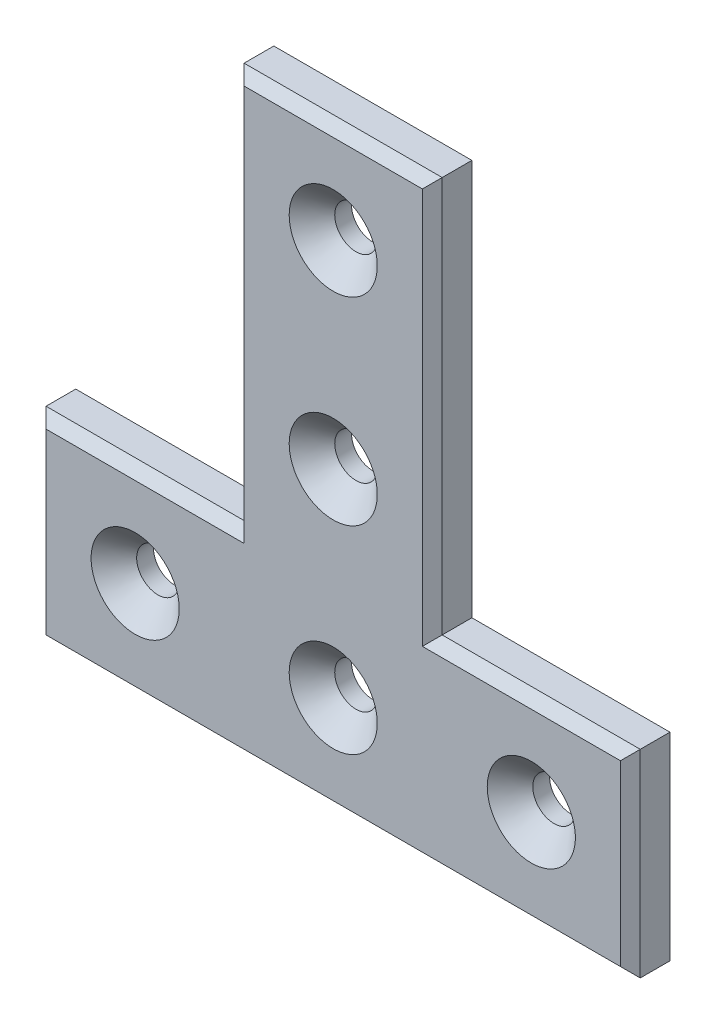
ISO-10303-21;
HEADER;
FILE_DESCRIPTION(('STEP AP214'),'2;1');
FILE_NAME('part.step','',(''),(''),'','','');
FILE_SCHEMA(('AUTOMOTIVE_DESIGN { 1 0 10303 214 1 1 1 1 }'));
ENDSEC;
DATA;
#1=APPLICATION_CONTEXT('core data for automotive mechanical design processes');
#2=APPLICATION_PROTOCOL_DEFINITION('international standard','automotive_design',2000,#1);
#3=PRODUCT_CONTEXT('',#1,'mechanical');
#4=PRODUCT('Part','Part','',(#3));
#5=PRODUCT_RELATED_PRODUCT_CATEGORY('part','',(#4));
#6=PRODUCT_DEFINITION_FORMATION('','',#4);
#7=PRODUCT_DEFINITION_CONTEXT('part definition',#1,'design');
#8=PRODUCT_DEFINITION('design','',#6,#7);
#9=PRODUCT_DEFINITION_SHAPE('','',#8);
#10=(LENGTH_UNIT() NAMED_UNIT(*) SI_UNIT(.MILLI.,.METRE.));
#11=(NAMED_UNIT(*) PLANE_ANGLE_UNIT() SI_UNIT($,.RADIAN.));
#12=(NAMED_UNIT(*) SI_UNIT($,.STERADIAN.) SOLID_ANGLE_UNIT());
#13=UNCERTAINTY_MEASURE_WITH_UNIT(LENGTH_MEASURE(1.E-05),#10,'distance_accuracy_value','');
#14=(GEOMETRIC_REPRESENTATION_CONTEXT(3) GLOBAL_UNCERTAINTY_ASSIGNED_CONTEXT((#13)) GLOBAL_UNIT_ASSIGNED_CONTEXT((#10,
#11,#12)) REPRESENTATION_CONTEXT('',''));
#15=CARTESIAN_POINT('',(0.,0.,0.));
#16=DIRECTION('',(0.,0.,1.));
#17=DIRECTION('',(1.,0.,0.));
#18=AXIS2_PLACEMENT_3D('',#15,#16,#17);
#19=CARTESIAN_POINT('',(0.,0.,4.));
#20=DIRECTION('',(0.,0.,-1.));
#21=DIRECTION('',(-1.,0.,0.));
#22=AXIS2_PLACEMENT_3D('',#19,#20,#21);
#23=PLANE('',#22);
#24=DIRECTION('',(0.,-1.,0.));
#25=VECTOR('',#24,1.);
#26=CARTESIAN_POINT('',(-29.,0.,4.));
#27=LINE('',#26,#25);
#28=CARTESIAN_POINT('',(-29.,9.00000000000001,4.));
#29=VERTEX_POINT('',#28);
#30=CARTESIAN_POINT('',(-29.,-9.00000000000001,4.));
#31=VERTEX_POINT('',#30);
#32=EDGE_CURVE('E226',#29,#31,#27,.T.);
#33=ORIENTED_EDGE('',*,*,#32,.T.);
#34=DIRECTION('',(1.,0.,0.));
#35=VECTOR('',#34,1.);
#36=CARTESIAN_POINT('',(0.,-9.00000000000001,4.));
#37=LINE('',#36,#35);
#38=CARTESIAN_POINT('',(29.,-9.00000000000001,4.));
#39=VERTEX_POINT('',#38);
#40=EDGE_CURVE('E228',#31,#39,#37,.T.);
#41=ORIENTED_EDGE('',*,*,#40,.T.);
#42=DIRECTION('',(0.,1.,0.));
#43=VECTOR('',#42,1.);
#44=CARTESIAN_POINT('',(29.,0.,4.));
#45=LINE('',#44,#43);
#46=CARTESIAN_POINT('',(29.,9.00000000000001,4.));
#47=VERTEX_POINT('',#46);
#48=EDGE_CURVE('E214',#39,#47,#45,.T.);
#49=ORIENTED_EDGE('',*,*,#48,.T.);
#50=DIRECTION('',(-1.,0.,0.));
#51=VECTOR('',#50,1.);
#52=CARTESIAN_POINT('',(0.,9.00000000000001,4.));
#53=LINE('',#52,#51);
#54=CARTESIAN_POINT('',(9.00000000000001,9.00000000000001,4.));
#55=VERTEX_POINT('',#54);
#56=EDGE_CURVE('E216',#47,#55,#53,.T.);
#57=ORIENTED_EDGE('',*,*,#56,.T.);
#58=DIRECTION('',(0.,1.,0.));
#59=VECTOR('',#58,1.);
#60=CARTESIAN_POINT('',(9.00000000000001,0.,4.));
#61=LINE('',#60,#59);
#62=CARTESIAN_POINT('',(9.00000000000001,49.,4.));
#63=VERTEX_POINT('',#62);
#64=EDGE_CURVE('E218',#55,#63,#61,.T.);
#65=ORIENTED_EDGE('',*,*,#64,.T.);
#66=DIRECTION('',(-1.,0.,0.));
#67=VECTOR('',#66,1.);
#68=CARTESIAN_POINT('',(0.,49.,4.));
#69=LINE('',#68,#67);
#70=CARTESIAN_POINT('',(-9.00000000000001,49.,4.));
#71=VERTEX_POINT('',#70);
#72=EDGE_CURVE('E220',#63,#71,#69,.T.);
#73=ORIENTED_EDGE('',*,*,#72,.T.);
#74=DIRECTION('',(0.,-1.,0.));
#75=VECTOR('',#74,1.);
#76=CARTESIAN_POINT('',(-9.00000000000001,0.,4.));
#77=LINE('',#76,#75);
#78=CARTESIAN_POINT('',(-9.00000000000001,9.00000000000001,4.));
#79=VERTEX_POINT('',#78);
#80=EDGE_CURVE('E222',#71,#79,#77,.T.);
#81=ORIENTED_EDGE('',*,*,#80,.T.);
#82=DIRECTION('',(-1.,0.,0.));
#83=VECTOR('',#82,1.);
#84=CARTESIAN_POINT('',(0.,9.00000000000001,4.));
#85=LINE('',#84,#83);
#86=EDGE_CURVE('E224',#79,#29,#85,.T.);
#87=ORIENTED_EDGE('',*,*,#86,.T.);
#88=EDGE_LOOP('',(#33,#41,#49,#57,#65,#73,#81,#87));
#89=FACE_BOUND('',#88,.T.);
#90=CARTESIAN_POINT('',(20.,0.,4.));
#91=DIRECTION('',(0.,0.,-1.));
#92=DIRECTION('',(-1.,0.,0.));
#93=AXIS2_PLACEMENT_3D('',#90,#91,#92);
#94=CIRCLE('',#93,4.45000000000002);
#95=CARTESIAN_POINT('',(15.55,0.,4.));
#96=VERTEX_POINT('',#95);
#97=EDGE_CURVE('E199',#96,#96,#94,.T.);
#98=ORIENTED_EDGE('',*,*,#97,.T.);
#99=EDGE_LOOP('',(#98));
#100=FACE_BOUND('',#99,.T.);
#101=CARTESIAN_POINT('',(0.,0.,4.));
#102=DIRECTION('',(0.,0.,-1.));
#103=DIRECTION('',(-1.,0.,0.));
#104=AXIS2_PLACEMENT_3D('',#101,#102,#103);
#105=CIRCLE('',#104,4.45000000000003);
#106=CARTESIAN_POINT('',(-4.45000000000003,0.,4.));
#107=VERTEX_POINT('',#106);
#108=EDGE_CURVE('E196',#107,#107,#105,.T.);
#109=ORIENTED_EDGE('',*,*,#108,.T.);
#110=EDGE_LOOP('',(#109));
#111=FACE_BOUND('',#110,.T.);
#112=CARTESIAN_POINT('',(-20.,0.,4.));
#113=DIRECTION('',(0.,0.,-1.));
#114=DIRECTION('',(-1.,0.,0.));
#115=AXIS2_PLACEMENT_3D('',#112,#113,#114);
#116=CIRCLE('',#115,4.45000000000002);
#117=CARTESIAN_POINT('',(-15.55,0.,4.));
#118=VERTEX_POINT('',#117);
#119=EDGE_CURVE('E193',#118,#118,#116,.T.);
#120=ORIENTED_EDGE('',*,*,#119,.T.);
#121=EDGE_LOOP('',(#120));
#122=FACE_BOUND('',#121,.T.);
#123=CARTESIAN_POINT('',(0.,20.,4.));
#124=DIRECTION('',(0.,0.,-1.));
#125=DIRECTION('',(-1.,0.,0.));
#126=AXIS2_PLACEMENT_3D('',#123,#124,#125);
#127=CIRCLE('',#126,4.45000000000002);
#128=CARTESIAN_POINT('',(-4.45000000000002,20.,4.));
#129=VERTEX_POINT('',#128);
#130=EDGE_CURVE('E190',#129,#129,#127,.T.);
#131=ORIENTED_EDGE('',*,*,#130,.T.);
#132=EDGE_LOOP('',(#131));
#133=FACE_BOUND('',#132,.T.);
#134=CARTESIAN_POINT('',(0.,40.,4.));
#135=DIRECTION('',(0.,0.,-1.));
#136=DIRECTION('',(-1.,0.,0.));
#137=AXIS2_PLACEMENT_3D('',#134,#135,#136);
#138=CIRCLE('',#137,4.45000000000002);
#139=CARTESIAN_POINT('',(-4.45000000000002,40.,4.));
#140=VERTEX_POINT('',#139);
#141=EDGE_CURVE('E187',#140,#140,#138,.T.);
#142=ORIENTED_EDGE('',*,*,#141,.T.);
#143=EDGE_LOOP('',(#142));
#144=FACE_BOUND('',#143,.T.);
#145=ADVANCED_FACE('F37',(#89,#100,#111,#122,#133,#144),#23,.F.);
#146=CARTESIAN_POINT('',(0.,0.,0.));
#147=DIRECTION('',(0.,0.,-1.));
#148=DIRECTION('',(-1.,0.,0.));
#149=AXIS2_PLACEMENT_3D('',#146,#147,#148);
#150=PLANE('',#149);
#151=CARTESIAN_POINT('',(0.,40.,0.));
#152=DIRECTION('',(0.,0.,1.));
#153=DIRECTION('',(1.,0.,0.));
#154=AXIS2_PLACEMENT_3D('',#151,#152,#153);
#155=CIRCLE('',#154,2.15);
#156=CARTESIAN_POINT('',(2.15,40.,0.));
#157=VERTEX_POINT('',#156);
#158=EDGE_CURVE('E271',#157,#157,#155,.T.);
#159=ORIENTED_EDGE('',*,*,#158,.T.);
#160=EDGE_LOOP('',(#159));
#161=FACE_BOUND('',#160,.T.);
#162=CARTESIAN_POINT('',(0.,20.,0.));
#163=DIRECTION('',(0.,0.,1.));
#164=DIRECTION('',(1.,0.,0.));
#165=AXIS2_PLACEMENT_3D('',#162,#163,#164);
#166=CIRCLE('',#165,2.15);
#167=CARTESIAN_POINT('',(2.15,20.,0.));
#168=VERTEX_POINT('',#167);
#169=EDGE_CURVE('E154',#168,#168,#166,.T.);
#170=ORIENTED_EDGE('',*,*,#169,.T.);
#171=EDGE_LOOP('',(#170));
#172=FACE_BOUND('',#171,.T.);
#173=DIRECTION('',(0.,1.,0.));
#174=VECTOR('',#173,1.);
#175=CARTESIAN_POINT('',(30.,-10.,0.));
#176=LINE('',#175,#174);
#177=CARTESIAN_POINT('',(30.,-10.,0.));
#178=VERTEX_POINT('',#177);
#179=CARTESIAN_POINT('',(30.,10.,0.));
#180=VERTEX_POINT('',#179);
#181=EDGE_CURVE('E142',#178,#180,#176,.T.);
#182=ORIENTED_EDGE('',*,*,#181,.F.);
#183=DIRECTION('',(1.,0.,0.));
#184=VECTOR('',#183,1.);
#185=CARTESIAN_POINT('',(-30.,-10.,0.));
#186=LINE('',#185,#184);
#187=CARTESIAN_POINT('',(-30.,-10.,0.));
#188=VERTEX_POINT('',#187);
#189=EDGE_CURVE('E171',#188,#178,#186,.T.);
#190=ORIENTED_EDGE('',*,*,#189,.F.);
#191=DIRECTION('',(0.,-1.,0.));
#192=VECTOR('',#191,1.);
#193=CARTESIAN_POINT('',(-30.,-10.,0.));
#194=LINE('',#193,#192);
#195=CARTESIAN_POINT('',(-30.,10.,0.));
#196=VERTEX_POINT('',#195);
#197=EDGE_CURVE('E168',#196,#188,#194,.T.);
#198=ORIENTED_EDGE('',*,*,#197,.F.);
#199=DIRECTION('',(-1.,0.,0.));
#200=VECTOR('',#199,1.);
#201=CARTESIAN_POINT('',(-30.,10.,0.));
#202=LINE('',#201,#200);
#203=CARTESIAN_POINT('',(-10.,10.,0.));
#204=VERTEX_POINT('',#203);
#205=EDGE_CURVE('E165',#204,#196,#202,.T.);
#206=ORIENTED_EDGE('',*,*,#205,.F.);
#207=DIRECTION('',(0.,-1.,0.));
#208=VECTOR('',#207,1.);
#209=CARTESIAN_POINT('',(-10.,10.,0.));
#210=LINE('',#209,#208);
#211=CARTESIAN_POINT('',(-10.,50.,0.));
#212=VERTEX_POINT('',#211);
#213=EDGE_CURVE('E162',#212,#204,#210,.T.);
#214=ORIENTED_EDGE('',*,*,#213,.F.);
#215=DIRECTION('',(-1.,0.,0.));
#216=VECTOR('',#215,1.);
#217=CARTESIAN_POINT('',(-10.,50.,0.));
#218=LINE('',#217,#216);
#219=CARTESIAN_POINT('',(10.,50.,0.));
#220=VERTEX_POINT('',#219);
#221=EDGE_CURVE('E159',#220,#212,#218,.T.);
#222=ORIENTED_EDGE('',*,*,#221,.F.);
#223=DIRECTION('',(0.,1.,0.));
#224=VECTOR('',#223,1.);
#225=CARTESIAN_POINT('',(10.,10.,0.));
#226=LINE('',#225,#224);
#227=CARTESIAN_POINT('',(10.,10.,0.));
#228=VERTEX_POINT('',#227);
#229=EDGE_CURVE('E145',#228,#220,#226,.T.);
#230=ORIENTED_EDGE('',*,*,#229,.F.);
#231=DIRECTION('',(-1.,0.,0.));
#232=VECTOR('',#231,1.);
#233=CARTESIAN_POINT('',(10.,10.,0.));
#234=LINE('',#233,#232);
#235=EDGE_CURVE('E129',#180,#228,#234,.T.);
#236=ORIENTED_EDGE('',*,*,#235,.F.);
#237=EDGE_LOOP('',(#182,#190,#198,#206,#214,#222,#230,#236));
#238=FACE_BOUND('',#237,.T.);
#239=CARTESIAN_POINT('',(20.,0.,0.));
#240=DIRECTION('',(0.,0.,1.));
#241=DIRECTION('',(1.,0.,0.));
#242=AXIS2_PLACEMENT_3D('',#239,#240,#241);
#243=CIRCLE('',#242,2.15);
#244=CARTESIAN_POINT('',(22.15,0.,0.));
#245=VERTEX_POINT('',#244);
#246=EDGE_CURVE('E151',#245,#245,#243,.T.);
#247=ORIENTED_EDGE('',*,*,#246,.T.);
#248=EDGE_LOOP('',(#247));
#249=FACE_BOUND('',#248,.T.);
#250=CARTESIAN_POINT('',(-20.,0.,0.));
#251=DIRECTION('',(0.,0.,1.));
#252=DIRECTION('',(1.,0.,0.));
#253=AXIS2_PLACEMENT_3D('',#250,#251,#252);
#254=CIRCLE('',#253,2.15);
#255=CARTESIAN_POINT('',(-17.85,0.,0.));
#256=VERTEX_POINT('',#255);
#257=EDGE_CURVE('E276',#256,#256,#254,.T.);
#258=ORIENTED_EDGE('',*,*,#257,.T.);
#259=EDGE_LOOP('',(#258));
#260=FACE_BOUND('',#259,.T.);
#261=CARTESIAN_POINT('',(0.,0.,0.));
#262=DIRECTION('',(0.,0.,1.));
#263=DIRECTION('',(1.,0.,0.));
#264=AXIS2_PLACEMENT_3D('',#261,#262,#263);
#265=CIRCLE('',#264,2.15);
#266=CARTESIAN_POINT('',(2.15,0.,0.));
#267=VERTEX_POINT('',#266);
#268=EDGE_CURVE('E265',#267,#267,#265,.T.);
#269=ORIENTED_EDGE('',*,*,#268,.T.);
#270=EDGE_LOOP('',(#269));
#271=FACE_BOUND('',#270,.T.);
#272=ADVANCED_FACE('F139',(#161,#172,#238,#249,#260,#271),#150,.T.);
#273=CARTESIAN_POINT('',(30.,-10.,4.));
#274=DIRECTION('',(-1.,0.,0.));
#275=DIRECTION('',(0.,-1.,0.));
#276=AXIS2_PLACEMENT_3D('',#273,#274,#275);
#277=PLANE('',#276);
#278=DIRECTION('',(0.,0.,-1.));
#279=VECTOR('',#278,1.);
#280=CARTESIAN_POINT('',(30.,10.,4.));
#281=LINE('',#280,#279);
#282=CARTESIAN_POINT('',(30.,10.,3.00000000000001));
#283=VERTEX_POINT('',#282);
#284=EDGE_CURVE('E126',#283,#180,#281,.T.);
#285=ORIENTED_EDGE('',*,*,#284,.F.);
#286=DIRECTION('',(0.,-1.,0.));
#287=VECTOR('',#286,1.);
#288=CARTESIAN_POINT('',(30.,-10.,3.00000000000001));
#289=LINE('',#288,#287);
#290=CARTESIAN_POINT('',(30.,-10.,3.00000000000001));
#291=VERTEX_POINT('',#290);
#292=EDGE_CURVE('E11',#283,#291,#289,.T.);
#293=ORIENTED_EDGE('',*,*,#292,.T.);
#294=DIRECTION('',(0.,0.,-1.));
#295=VECTOR('',#294,1.);
#296=CARTESIAN_POINT('',(30.,-10.,4.));
#297=LINE('',#296,#295);
#298=EDGE_CURVE('E149',#291,#178,#297,.T.);
#299=ORIENTED_EDGE('',*,*,#298,.T.);
#300=ORIENTED_EDGE('',*,*,#181,.T.);
#301=EDGE_LOOP('',(#285,#293,#299,#300));
#302=FACE_BOUND('',#301,.T.);
#303=ADVANCED_FACE('F147',(#302),#277,.F.);
#304=CARTESIAN_POINT('',(10.,10.,4.));
#305=DIRECTION('',(0.,-1.,0.));
#306=DIRECTION('',(1.,0.,0.));
#307=AXIS2_PLACEMENT_3D('',#304,#305,#306);
#308=PLANE('',#307);
#309=DIRECTION('',(0.,0.,-1.));
#310=VECTOR('',#309,1.);
#311=CARTESIAN_POINT('',(10.,10.,4.));
#312=LINE('',#311,#310);
#313=CARTESIAN_POINT('',(10.,10.,3.00000000000001));
#314=VERTEX_POINT('',#313);
#315=EDGE_CURVE('E135',#314,#228,#312,.T.);
#316=ORIENTED_EDGE('',*,*,#315,.F.);
#317=DIRECTION('',(1.,0.,0.));
#318=VECTOR('',#317,1.);
#319=CARTESIAN_POINT('',(10.,10.,3.00000000000001));
#320=LINE('',#319,#318);
#321=EDGE_CURVE('E47',#314,#283,#320,.T.);
#322=ORIENTED_EDGE('',*,*,#321,.T.);
#323=ORIENTED_EDGE('',*,*,#284,.T.);
#324=ORIENTED_EDGE('',*,*,#235,.T.);
#325=EDGE_LOOP('',(#316,#322,#323,#324));
#326=FACE_BOUND('',#325,.T.);
#327=ADVANCED_FACE('F128',(#326),#308,.F.);
#328=CARTESIAN_POINT('',(10.,10.,4.));
#329=DIRECTION('',(-1.,0.,0.));
#330=DIRECTION('',(0.,0.,1.));
#331=AXIS2_PLACEMENT_3D('',#328,#329,#330);
#332=PLANE('',#331);
#333=DIRECTION('',(0.,0.,-1.));
#334=VECTOR('',#333,1.);
#335=CARTESIAN_POINT('',(10.,50.,4.));
#336=LINE('',#335,#334);
#337=CARTESIAN_POINT('',(10.,50.,3.00000000000001));
#338=VERTEX_POINT('',#337);
#339=EDGE_CURVE('E182',#338,#220,#336,.T.);
#340=ORIENTED_EDGE('',*,*,#339,.F.);
#341=DIRECTION('',(0.,-1.,0.));
#342=VECTOR('',#341,1.);
#343=CARTESIAN_POINT('',(10.,10.,3.00000000000001));
#344=LINE('',#343,#342);
#345=EDGE_CURVE('E62',#338,#314,#344,.T.);
#346=ORIENTED_EDGE('',*,*,#345,.T.);
#347=ORIENTED_EDGE('',*,*,#315,.T.);
#348=ORIENTED_EDGE('',*,*,#229,.T.);
#349=EDGE_LOOP('',(#340,#346,#347,#348));
#350=FACE_BOUND('',#349,.T.);
#351=ADVANCED_FACE('F328',(#350),#332,.F.);
#352=CARTESIAN_POINT('',(-10.,50.,4.));
#353=DIRECTION('',(0.,-1.,0.));
#354=DIRECTION('',(0.,0.,-1.));
#355=AXIS2_PLACEMENT_3D('',#352,#353,#354);
#356=PLANE('',#355);
#357=DIRECTION('',(0.,0.,-1.));
#358=VECTOR('',#357,1.);
#359=CARTESIAN_POINT('',(-10.,50.,4.));
#360=LINE('',#359,#358);
#361=CARTESIAN_POINT('',(-10.,50.,3.00000000000001));
#362=VERTEX_POINT('',#361);
#363=EDGE_CURVE('E180',#362,#212,#360,.T.);
#364=ORIENTED_EDGE('',*,*,#363,.F.);
#365=DIRECTION('',(1.,0.,0.));
#366=VECTOR('',#365,1.);
#367=CARTESIAN_POINT('',(-10.,50.,3.00000000000001));
#368=LINE('',#367,#366);
#369=EDGE_CURVE('E240',#362,#338,#368,.T.);
#370=ORIENTED_EDGE('',*,*,#369,.T.);
#371=ORIENTED_EDGE('',*,*,#339,.T.);
#372=ORIENTED_EDGE('',*,*,#221,.T.);
#373=EDGE_LOOP('',(#364,#370,#371,#372));
#374=FACE_BOUND('',#373,.T.);
#375=ADVANCED_FACE('F324',(#374),#356,.F.);
#376=CARTESIAN_POINT('',(-10.,10.,4.));
#377=DIRECTION('',(1.,0.,0.));
#378=DIRECTION('',(0.,0.,-1.));
#379=AXIS2_PLACEMENT_3D('',#376,#377,#378);
#380=PLANE('',#379);
#381=DIRECTION('',(0.,0.,-1.));
#382=VECTOR('',#381,1.);
#383=CARTESIAN_POINT('',(-10.,10.,4.));
#384=LINE('',#383,#382);
#385=CARTESIAN_POINT('',(-10.,10.,3.00000000000001));
#386=VERTEX_POINT('',#385);
#387=EDGE_CURVE('E178',#386,#204,#384,.T.);
#388=ORIENTED_EDGE('',*,*,#387,.F.);
#389=DIRECTION('',(0.,1.,0.));
#390=VECTOR('',#389,1.);
#391=CARTESIAN_POINT('',(-10.,10.,3.00000000000001));
#392=LINE('',#391,#390);
#393=EDGE_CURVE('E238',#386,#362,#392,.T.);
#394=ORIENTED_EDGE('',*,*,#393,.T.);
#395=ORIENTED_EDGE('',*,*,#363,.T.);
#396=ORIENTED_EDGE('',*,*,#213,.T.);
#397=EDGE_LOOP('',(#388,#394,#395,#396));
#398=FACE_BOUND('',#397,.T.);
#399=ADVANCED_FACE('F320',(#398),#380,.F.);
#400=CARTESIAN_POINT('',(-30.,10.,4.));
#401=DIRECTION('',(0.,-1.,0.));
#402=DIRECTION('',(1.,0.,0.));
#403=AXIS2_PLACEMENT_3D('',#400,#401,#402);
#404=PLANE('',#403);
#405=DIRECTION('',(0.,0.,-1.));
#406=VECTOR('',#405,1.);
#407=CARTESIAN_POINT('',(-30.,10.,4.));
#408=LINE('',#407,#406);
#409=CARTESIAN_POINT('',(-30.,10.,3.00000000000001));
#410=VERTEX_POINT('',#409);
#411=EDGE_CURVE('E176',#410,#196,#408,.T.);
#412=ORIENTED_EDGE('',*,*,#411,.F.);
#413=DIRECTION('',(1.,0.,0.));
#414=VECTOR('',#413,1.);
#415=CARTESIAN_POINT('',(-30.,10.,3.00000000000001));
#416=LINE('',#415,#414);
#417=EDGE_CURVE('E236',#410,#386,#416,.T.);
#418=ORIENTED_EDGE('',*,*,#417,.T.);
#419=ORIENTED_EDGE('',*,*,#387,.T.);
#420=ORIENTED_EDGE('',*,*,#205,.T.);
#421=EDGE_LOOP('',(#412,#418,#419,#420));
#422=FACE_BOUND('',#421,.T.);
#423=ADVANCED_FACE('F316',(#422),#404,.F.);
#424=CARTESIAN_POINT('',(-30.,-10.,4.));
#425=DIRECTION('',(1.,0.,0.));
#426=DIRECTION('',(0.,0.,-1.));
#427=AXIS2_PLACEMENT_3D('',#424,#425,#426);
#428=PLANE('',#427);
#429=DIRECTION('',(0.,0.,-1.));
#430=VECTOR('',#429,1.);
#431=CARTESIAN_POINT('',(-30.,-10.,4.));
#432=LINE('',#431,#430);
#433=CARTESIAN_POINT('',(-30.,-10.,3.00000000000001));
#434=VERTEX_POINT('',#433);
#435=EDGE_CURVE('E174',#434,#188,#432,.T.);
#436=ORIENTED_EDGE('',*,*,#435,.F.);
#437=DIRECTION('',(0.,1.,0.));
#438=VECTOR('',#437,1.);
#439=CARTESIAN_POINT('',(-30.,-10.,3.00000000000001));
#440=LINE('',#439,#438);
#441=EDGE_CURVE('E234',#434,#410,#440,.T.);
#442=ORIENTED_EDGE('',*,*,#441,.T.);
#443=ORIENTED_EDGE('',*,*,#411,.T.);
#444=ORIENTED_EDGE('',*,*,#197,.T.);
#445=EDGE_LOOP('',(#436,#442,#443,#444));
#446=FACE_BOUND('',#445,.T.);
#447=ADVANCED_FACE('F312',(#446),#428,.F.);
#448=CARTESIAN_POINT('',(-30.,-10.,4.));
#449=DIRECTION('',(0.,1.,0.));
#450=DIRECTION('',(0.,0.,1.));
#451=AXIS2_PLACEMENT_3D('',#448,#449,#450);
#452=PLANE('',#451);
#453=ORIENTED_EDGE('',*,*,#298,.F.);
#454=DIRECTION('',(-1.,0.,0.));
#455=VECTOR('',#454,1.);
#456=CARTESIAN_POINT('',(-30.,-10.,3.00000000000001));
#457=LINE('',#456,#455);
#458=EDGE_CURVE('E231',#291,#434,#457,.T.);
#459=ORIENTED_EDGE('',*,*,#458,.T.);
#460=ORIENTED_EDGE('',*,*,#435,.T.);
#461=ORIENTED_EDGE('',*,*,#189,.T.);
#462=EDGE_LOOP('',(#453,#459,#460,#461));
#463=FACE_BOUND('',#462,.T.);
#464=ADVANCED_FACE('F297',(#463),#452,.F.);
#465=CARTESIAN_POINT('',(20.,0.,4.));
#466=DIRECTION('',(0.,0.,-1.));
#467=DIRECTION('',(-1.,0.,0.));
#468=AXIS2_PLACEMENT_3D('',#465,#466,#467);
#469=CYLINDRICAL_SURFACE('',#468,2.15);
#470=CARTESIAN_POINT('',(20.,0.,1.69999999999998));
#471=DIRECTION('',(0.,0.,-1.));
#472=DIRECTION('',(-1.,0.,0.));
#473=AXIS2_PLACEMENT_3D('',#470,#471,#472);
#474=CIRCLE('',#473,2.15);
#475=CARTESIAN_POINT('',(17.85,0.,1.69999999999998));
#476=VERTEX_POINT('',#475);
#477=EDGE_CURVE('E134',#476,#476,#474,.F.);
#478=ORIENTED_EDGE('',*,*,#477,.T.);
#479=EDGE_LOOP('',(#478));
#480=FACE_BOUND('',#479,.T.);
#481=ORIENTED_EDGE('',*,*,#246,.F.);
#482=EDGE_LOOP('',(#481));
#483=FACE_BOUND('',#482,.T.);
#484=ADVANCED_FACE('F287',(#480,#483),#469,.F.);
#485=CARTESIAN_POINT('',(0.,20.,4.));
#486=DIRECTION('',(0.,0.,-1.));
#487=DIRECTION('',(-1.,0.,0.));
#488=AXIS2_PLACEMENT_3D('',#485,#486,#487);
#489=CYLINDRICAL_SURFACE('',#488,2.15);
#490=CARTESIAN_POINT('',(0.,20.,1.69999999999998));
#491=DIRECTION('',(0.,0.,-1.));
#492=DIRECTION('',(-1.,0.,0.));
#493=AXIS2_PLACEMENT_3D('',#490,#491,#492);
#494=CIRCLE('',#493,2.15);
#495=CARTESIAN_POINT('',(-2.15,20.,1.69999999999998));
#496=VERTEX_POINT('',#495);
#497=EDGE_CURVE('E208',#496,#496,#494,.F.);
#498=ORIENTED_EDGE('',*,*,#497,.T.);
#499=EDGE_LOOP('',(#498));
#500=FACE_BOUND('',#499,.T.);
#501=ORIENTED_EDGE('',*,*,#169,.F.);
#502=EDGE_LOOP('',(#501));
#503=FACE_BOUND('',#502,.T.);
#504=ADVANCED_FACE('F284',(#500,#503),#489,.F.);
#505=CARTESIAN_POINT('',(-20.,0.,4.));
#506=DIRECTION('',(0.,0.,-1.));
#507=DIRECTION('',(-1.,0.,0.));
#508=AXIS2_PLACEMENT_3D('',#505,#506,#507);
#509=CYLINDRICAL_SURFACE('',#508,2.15);
#510=CARTESIAN_POINT('',(-20.,0.,1.69999999999998));
#511=DIRECTION('',(0.,0.,-1.));
#512=DIRECTION('',(-1.,0.,0.));
#513=AXIS2_PLACEMENT_3D('',#510,#511,#512);
#514=CIRCLE('',#513,2.15);
#515=CARTESIAN_POINT('',(-17.85,0.,1.69999999999998));
#516=VERTEX_POINT('',#515);
#517=EDGE_CURVE('E205',#516,#516,#514,.F.);
#518=ORIENTED_EDGE('',*,*,#517,.T.);
#519=EDGE_LOOP('',(#518));
#520=FACE_BOUND('',#519,.T.);
#521=ORIENTED_EDGE('',*,*,#257,.F.);
#522=EDGE_LOOP('',(#521));
#523=FACE_BOUND('',#522,.T.);
#524=ADVANCED_FACE('F286',(#520,#523),#509,.F.);
#525=CARTESIAN_POINT('',(0.,40.,4.));
#526=DIRECTION('',(0.,0.,-1.));
#527=DIRECTION('',(-1.,0.,0.));
#528=AXIS2_PLACEMENT_3D('',#525,#526,#527);
#529=CYLINDRICAL_SURFACE('',#528,2.15);
#530=CARTESIAN_POINT('',(0.,40.,1.69999999999998));
#531=DIRECTION('',(0.,0.,-1.));
#532=DIRECTION('',(-1.,0.,0.));
#533=AXIS2_PLACEMENT_3D('',#530,#531,#532);
#534=CIRCLE('',#533,2.15);
#535=CARTESIAN_POINT('',(-2.15,40.,1.69999999999998));
#536=VERTEX_POINT('',#535);
#537=EDGE_CURVE('E211',#536,#536,#534,.F.);
#538=ORIENTED_EDGE('',*,*,#537,.T.);
#539=EDGE_LOOP('',(#538));
#540=FACE_BOUND('',#539,.T.);
#541=ORIENTED_EDGE('',*,*,#158,.F.);
#542=EDGE_LOOP('',(#541));
#543=FACE_BOUND('',#542,.T.);
#544=ADVANCED_FACE('F294',(#540,#543),#529,.F.);
#545=CARTESIAN_POINT('',(0.,0.,4.));
#546=DIRECTION('',(0.,0.,-1.));
#547=DIRECTION('',(-1.,0.,0.));
#548=AXIS2_PLACEMENT_3D('',#545,#546,#547);
#549=CYLINDRICAL_SURFACE('',#548,2.15);
#550=CARTESIAN_POINT('',(0.,0.,1.69999999999998));
#551=DIRECTION('',(0.,0.,-1.));
#552=DIRECTION('',(-1.,0.,0.));
#553=AXIS2_PLACEMENT_3D('',#550,#551,#552);
#554=CIRCLE('',#553,2.15);
#555=CARTESIAN_POINT('',(-2.15,0.,1.69999999999998));
#556=VERTEX_POINT('',#555);
#557=EDGE_CURVE('E202',#556,#556,#554,.F.);
#558=ORIENTED_EDGE('',*,*,#557,.T.);
#559=EDGE_LOOP('',(#558));
#560=FACE_BOUND('',#559,.T.);
#561=ORIENTED_EDGE('',*,*,#268,.F.);
#562=EDGE_LOOP('',(#561));
#563=FACE_BOUND('',#562,.T.);
#564=ADVANCED_FACE('F344',(#560,#563),#549,.F.);
#565=CARTESIAN_POINT('',(20.,0.,1.69999999999998));
#566=DIRECTION('',(0.,0.,1.));
#567=DIRECTION('',(1.,0.,0.));
#568=AXIS2_PLACEMENT_3D('',#565,#566,#567);
#569=CONICAL_SURFACE('',#568,2.15,0.785398163397449);
#570=ORIENTED_EDGE('',*,*,#97,.F.);
#571=EDGE_LOOP('',(#570));
#572=FACE_BOUND('',#571,.T.);
#573=ORIENTED_EDGE('',*,*,#477,.F.);
#574=EDGE_LOOP('',(#573));
#575=FACE_BOUND('',#574,.T.);
#576=ADVANCED_FACE('F337',(#572,#575),#569,.F.);
#577=CARTESIAN_POINT('',(0.,0.,1.69999999999998));
#578=DIRECTION('',(0.,0.,1.));
#579=DIRECTION('',(1.,0.,0.));
#580=AXIS2_PLACEMENT_3D('',#577,#578,#579);
#581=CONICAL_SURFACE('',#580,2.15,0.78539816339745);
#582=ORIENTED_EDGE('',*,*,#108,.F.);
#583=EDGE_LOOP('',(#582));
#584=FACE_BOUND('',#583,.T.);
#585=ORIENTED_EDGE('',*,*,#557,.F.);
#586=EDGE_LOOP('',(#585));
#587=FACE_BOUND('',#586,.T.);
#588=ADVANCED_FACE('F343',(#584,#587),#581,.F.);
#589=CARTESIAN_POINT('',(-20.,0.,1.69999999999998));
#590=DIRECTION('',(0.,0.,1.));
#591=DIRECTION('',(1.,0.,0.));
#592=AXIS2_PLACEMENT_3D('',#589,#590,#591);
#593=CONICAL_SURFACE('',#592,2.15,0.785398163397449);
#594=CARTESIAN_POINT('',(-15.55,0.,4.));
#595=CARTESIAN_POINT('',(-15.5739583333333,0.,3.97604166666667));
#596=CARTESIAN_POINT('',(-15.5979166666667,0.,3.95208333333333));
#597=CARTESIAN_POINT('',(-15.6458333333333,0.,3.90416666666667));
#598=CARTESIAN_POINT('',(-15.6697916666667,0.,3.88020833333333));
#599=CARTESIAN_POINT('',(-15.7177083333333,0.,3.83229166666667));
#600=CARTESIAN_POINT('',(-15.7416666666667,0.,3.80833333333333));
#601=CARTESIAN_POINT('',(-15.7895833333333,0.,3.76041666666667));
#602=CARTESIAN_POINT('',(-15.8135416666667,0.,3.73645833333333));
#603=CARTESIAN_POINT('',(-15.8614583333333,0.,3.68854166666666));
#604=CARTESIAN_POINT('',(-15.8854166666667,0.,3.66458333333333));
#605=CARTESIAN_POINT('',(-15.9333333333333,0.,3.61666666666666));
#606=CARTESIAN_POINT('',(-15.9572916666667,0.,3.59270833333333));
#607=CARTESIAN_POINT('',(-16.0052083333333,0.,3.54479166666666));
#608=CARTESIAN_POINT('',(-16.0291666666667,0.,3.52083333333333));
#609=CARTESIAN_POINT('',(-16.0770833333333,0.,3.47291666666666));
#610=CARTESIAN_POINT('',(-16.1010416666667,0.,3.44895833333333));
#611=CARTESIAN_POINT('',(-16.1489583333333,0.,3.40104166666666));
#612=CARTESIAN_POINT('',(-16.1729166666667,0.,3.37708333333333));
#613=CARTESIAN_POINT('',(-16.2208333333333,0.,3.32916666666666));
#614=CARTESIAN_POINT('',(-16.2447916666667,0.,3.30520833333333));
#615=CARTESIAN_POINT('',(-16.2927083333333,0.,3.25729166666666));
#616=CARTESIAN_POINT('',(-16.3166666666667,0.,3.23333333333333));
#617=CARTESIAN_POINT('',(-16.3645833333333,0.,3.18541666666666));
#618=CARTESIAN_POINT('',(-16.3885416666667,0.,3.16145833333333));
#619=CARTESIAN_POINT('',(-16.4364583333333,0.,3.11354166666666));
#620=CARTESIAN_POINT('',(-16.4604166666667,0.,3.08958333333333));
#621=CARTESIAN_POINT('',(-16.5083333333333,0.,3.04166666666666));
#622=CARTESIAN_POINT('',(-16.5322916666667,0.,3.01770833333333));
#623=CARTESIAN_POINT('',(-16.5802083333333,0.,2.96979166666666));
#624=CARTESIAN_POINT('',(-16.6041666666667,0.,2.94583333333332));
#625=CARTESIAN_POINT('',(-16.6520833333333,0.,2.89791666666666));
#626=CARTESIAN_POINT('',(-16.6760416666667,0.,2.87395833333332));
#627=CARTESIAN_POINT('',(-16.7239583333333,0.,2.82604166666666));
#628=CARTESIAN_POINT('',(-16.7479166666667,0.,2.80208333333332));
#629=CARTESIAN_POINT('',(-16.7958333333333,0.,2.75416666666666));
#630=CARTESIAN_POINT('',(-16.8197916666667,0.,2.73020833333332));
#631=CARTESIAN_POINT('',(-16.8677083333333,0.,2.68229166666666));
#632=CARTESIAN_POINT('',(-16.8916666666667,0.,2.65833333333332));
#633=CARTESIAN_POINT('',(-16.9395833333333,0.,2.61041666666666));
#634=CARTESIAN_POINT('',(-16.9635416666667,0.,2.58645833333332));
#635=CARTESIAN_POINT('',(-17.0114583333333,0.,2.53854166666666));
#636=CARTESIAN_POINT('',(-17.0354166666667,0.,2.51458333333332));
#637=CARTESIAN_POINT('',(-17.0833333333333,0.,2.46666666666665));
#638=CARTESIAN_POINT('',(-17.1072916666667,0.,2.44270833333332));
#639=CARTESIAN_POINT('',(-17.1552083333333,0.,2.39479166666665));
#640=CARTESIAN_POINT('',(-17.1791666666667,0.,2.37083333333332));
#641=CARTESIAN_POINT('',(-17.2270833333333,0.,2.32291666666665));
#642=CARTESIAN_POINT('',(-17.2510416666667,0.,2.29895833333332));
#643=CARTESIAN_POINT('',(-17.2989583333333,0.,2.25104166666665));
#644=CARTESIAN_POINT('',(-17.3229166666667,0.,2.22708333333332));
#645=CARTESIAN_POINT('',(-17.3708333333333,0.,2.17916666666665));
#646=CARTESIAN_POINT('',(-17.3947916666667,0.,2.15520833333332));
#647=CARTESIAN_POINT('',(-17.4427083333333,0.,2.10729166666665));
#648=CARTESIAN_POINT('',(-17.4666666666667,0.,2.08333333333332));
#649=CARTESIAN_POINT('',(-17.5145833333333,0.,2.03541666666665));
#650=CARTESIAN_POINT('',(-17.5385416666667,0.,2.01145833333332));
#651=CARTESIAN_POINT('',(-17.5864583333333,0.,1.96354166666665));
#652=CARTESIAN_POINT('',(-17.6104166666667,0.,1.93958333333332));
#653=CARTESIAN_POINT('',(-17.6583333333333,0.,1.89166666666665));
#654=CARTESIAN_POINT('',(-17.6822916666667,0.,1.86770833333332));
#655=CARTESIAN_POINT('',(-17.7302083333333,0.,1.81979166666665));
#656=CARTESIAN_POINT('',(-17.7541666666667,0.,1.79583333333332));
#657=CARTESIAN_POINT('',(-17.8020833333333,0.,1.74791666666665));
#658=CARTESIAN_POINT('',(-17.8260416666667,0.,1.72395833333332));
#659=CARTESIAN_POINT('',(-17.85,0.,1.69999999999998));
#660=B_SPLINE_CURVE_WITH_KNOTS('',3,(#594,#595,#596,#597,#598,#599,#600,#601,#602,#603,#604,
#605,#606,#607,#608,#609,#610,#611,#612,#613,#614,#615,#616,#617,#618,#619,#620,#621,#622,#623,
#624,#625,#626,#627,#628,#629,#630,#631,#632,#633,#634,#635,#636,#637,#638,#639,#640,#641,#642,
#643,#644,#645,#646,#647,#648,#649,#650,#651,#652,#653,#654,#655,#656,#657,#658,#659),
.UNSPECIFIED.,.F.,.F.,(4,2,2,2,2,2,2,2,2,2,2,2,2,2,2,2,2,2,2,2,2,2,2,2,2,2,2,2,2,2,2,2,4),(0.,
0.101646599795566,0.203293199591131,0.3049397993867,0.406586399182269,0.508232998977834,
0.609879598773402,0.711526198568968,0.813172798364537,0.914819398160103,1.01646599795567,
1.11811259775124,1.21975919754681,1.32140579734237,1.42305239713794,1.52469899693351,
1.62634559672907,1.72799219652464,1.82963879632021,1.93128539611577,2.03293199591134,
2.13457859570691,2.23622519550247,2.33787179529804,2.43951839509361,2.54116499488918,
2.64281159468474,2.74445819448031,2.84610479427588,2.94775139407145,3.04939799386701,
3.15104459366258,3.25269119345815),.UNSPECIFIED.);
#661=EDGE_CURVE('BSEAM351',#118,#516,#660,.T.);
#662=ORIENTED_EDGE('',*,*,#119,.F.);
#663=ORIENTED_EDGE('',*,*,#517,.F.);
#664=ORIENTED_EDGE('',*,*,#661,.T.);
#665=ORIENTED_EDGE('',*,*,#661,.F.);
#666=EDGE_LOOP('',(#662,#664,#663,#665));
#667=FACE_BOUND('',#666,.T.);
#668=ADVANCED_FACE('F351',(#667),#593,.F.);
#669=CARTESIAN_POINT('',(0.,20.,1.69999999999998));
#670=DIRECTION('',(0.,0.,1.));
#671=DIRECTION('',(1.,0.,0.));
#672=AXIS2_PLACEMENT_3D('',#669,#670,#671);
#673=CONICAL_SURFACE('',#672,2.15,0.78539816339745);
#674=ORIENTED_EDGE('',*,*,#130,.F.);
#675=EDGE_LOOP('',(#674));
#676=FACE_BOUND('',#675,.T.);
#677=ORIENTED_EDGE('',*,*,#497,.F.);
#678=EDGE_LOOP('',(#677));
#679=FACE_BOUND('',#678,.T.);
#680=ADVANCED_FACE('F358',(#676,#679),#673,.F.);
#681=CARTESIAN_POINT('',(0.,40.,1.69999999999998));
#682=DIRECTION('',(0.,0.,1.));
#683=DIRECTION('',(1.,0.,0.));
#684=AXIS2_PLACEMENT_3D('',#681,#682,#683);
#685=CONICAL_SURFACE('',#684,2.15,0.78539816339745);
#686=ORIENTED_EDGE('',*,*,#141,.F.);
#687=EDGE_LOOP('',(#686));
#688=FACE_BOUND('',#687,.T.);
#689=ORIENTED_EDGE('',*,*,#537,.F.);
#690=EDGE_LOOP('',(#689));
#691=FACE_BOUND('',#690,.T.);
#692=ADVANCED_FACE('F365',(#688,#691),#685,.F.);
#693=CARTESIAN_POINT('',(0.,49.,4.));
#694=DIRECTION('',(0.,-0.70710678118655,-0.707106781186545));
#695=DIRECTION('',(-1.,0.,0.));
#696=AXIS2_PLACEMENT_3D('',#693,#694,#695);
#697=PLANE('',#696);
#698=DIRECTION('',(-0.577350269189625,-0.577350269189625,0.577350269189629));
#699=VECTOR('',#698,1.);
#700=CARTESIAN_POINT('',(-7.33333333333325,32.6666666666668,20.3333333333334));
#701=LINE('',#700,#699);
#702=EDGE_CURVE('E259',#338,#63,#701,.T.);
#703=ORIENTED_EDGE('',*,*,#702,.F.);
#704=ORIENTED_EDGE('',*,*,#369,.F.);
#705=DIRECTION('',(0.577350269189625,-0.577350269189625,0.577350269189629));
#706=VECTOR('',#705,1.);
#707=CARTESIAN_POINT('',(-6.00000000000002,46.,7.00000000000001));
#708=LINE('',#707,#706);
#709=EDGE_CURVE('E42',#71,#362,#708,.F.);
#710=ORIENTED_EDGE('',*,*,#709,.F.);
#711=ORIENTED_EDGE('',*,*,#72,.F.);
#712=EDGE_LOOP('',(#703,#704,#710,#711));
#713=FACE_BOUND('',#712,.T.);
#714=ADVANCED_FACE('F40',(#713),#697,.F.);
#715=CARTESIAN_POINT('',(-9.00000000000001,0.,4.));
#716=DIRECTION('',(0.70710678118655,0.,-0.707106781186545));
#717=DIRECTION('',(0.,-1.,0.));
#718=AXIS2_PLACEMENT_3D('',#715,#716,#717);
#719=PLANE('',#718);
#720=ORIENTED_EDGE('',*,*,#709,.T.);
#721=ORIENTED_EDGE('',*,*,#393,.F.);
#722=DIRECTION('',(0.577350269189624,-0.577350269189625,0.577350269189628));
#723=VECTOR('',#722,1.);
#724=CARTESIAN_POINT('',(-6.00000000000002,6.00000000000002,7.00000000000001));
#725=LINE('',#724,#723);
#726=EDGE_CURVE('E257',#79,#386,#725,.F.);
#727=ORIENTED_EDGE('',*,*,#726,.F.);
#728=ORIENTED_EDGE('',*,*,#80,.F.);
#729=EDGE_LOOP('',(#720,#721,#727,#728));
#730=FACE_BOUND('',#729,.T.);
#731=ADVANCED_FACE('F413',(#730),#719,.F.);
#732=CARTESIAN_POINT('',(9.00000000000001,0.,4.));
#733=DIRECTION('',(-0.70710678118655,0.,-0.707106781186545));
#734=DIRECTION('',(0.,1.,0.));
#735=AXIS2_PLACEMENT_3D('',#732,#733,#734);
#736=PLANE('',#735);
#737=ORIENTED_EDGE('',*,*,#702,.T.);
#738=ORIENTED_EDGE('',*,*,#64,.F.);
#739=DIRECTION('',(-0.577350269189624,-0.577350269189626,0.577350269189628));
#740=VECTOR('',#739,1.);
#741=CARTESIAN_POINT('',(6.00000000000002,6.00000000000001,7.00000000000001));
#742=LINE('',#741,#740);
#743=EDGE_CURVE('E254',#314,#55,#742,.T.);
#744=ORIENTED_EDGE('',*,*,#743,.F.);
#745=ORIENTED_EDGE('',*,*,#345,.F.);
#746=EDGE_LOOP('',(#737,#738,#744,#745));
#747=FACE_BOUND('',#746,.T.);
#748=ADVANCED_FACE('F407',(#747),#736,.F.);
#749=CARTESIAN_POINT('',(0.,9.00000000000001,4.));
#750=DIRECTION('',(0.,-0.70710678118655,-0.707106781186545));
#751=DIRECTION('',(-1.,0.,0.));
#752=AXIS2_PLACEMENT_3D('',#749,#750,#751);
#753=PLANE('',#752);
#754=ORIENTED_EDGE('',*,*,#726,.T.);
#755=ORIENTED_EDGE('',*,*,#417,.F.);
#756=DIRECTION('',(0.577350269189624,-0.577350269189625,0.577350269189628));
#757=VECTOR('',#756,1.);
#758=CARTESIAN_POINT('',(-19.3333333333334,-0.666666666666614,13.6666666666667));
#759=LINE('',#758,#757);
#760=EDGE_CURVE('E251',#29,#410,#759,.F.);
#761=ORIENTED_EDGE('',*,*,#760,.F.);
#762=ORIENTED_EDGE('',*,*,#86,.F.);
#763=EDGE_LOOP('',(#754,#755,#761,#762));
#764=FACE_BOUND('',#763,.T.);
#765=ADVANCED_FACE('F400',(#764),#753,.F.);
#766=CARTESIAN_POINT('',(0.,9.00000000000001,4.));
#767=DIRECTION('',(0.,-0.707106781186549,-0.707106781186546));
#768=DIRECTION('',(-1.,0.,0.));
#769=AXIS2_PLACEMENT_3D('',#766,#767,#768);
#770=PLANE('',#769);
#771=ORIENTED_EDGE('',*,*,#743,.T.);
#772=ORIENTED_EDGE('',*,*,#56,.F.);
#773=DIRECTION('',(-0.577350269189625,-0.577350269189625,0.577350269189628));
#774=VECTOR('',#773,1.);
#775=CARTESIAN_POINT('',(26.,6.00000000000001,7.00000000000001));
#776=LINE('',#775,#774);
#777=EDGE_CURVE('E248',#283,#47,#776,.T.);
#778=ORIENTED_EDGE('',*,*,#777,.F.);
#779=ORIENTED_EDGE('',*,*,#321,.F.);
#780=EDGE_LOOP('',(#771,#772,#778,#779));
#781=FACE_BOUND('',#780,.T.);
#782=ADVANCED_FACE('F393',(#781),#770,.F.);
#783=CARTESIAN_POINT('',(-29.,0.,4.));
#784=DIRECTION('',(0.70710678118655,0.,-0.707106781186545));
#785=DIRECTION('',(0.,-1.,0.));
#786=AXIS2_PLACEMENT_3D('',#783,#784,#785);
#787=PLANE('',#786);
#788=ORIENTED_EDGE('',*,*,#760,.T.);
#789=ORIENTED_EDGE('',*,*,#441,.F.);
#790=DIRECTION('',(0.577350269189625,0.577350269189625,0.577350269189629));
#791=VECTOR('',#790,1.);
#792=CARTESIAN_POINT('',(-26.,-6.00000000000002,7.00000000000001));
#793=LINE('',#792,#791);
#794=EDGE_CURVE('E246',#31,#434,#793,.F.);
#795=ORIENTED_EDGE('',*,*,#794,.F.);
#796=ORIENTED_EDGE('',*,*,#32,.F.);
#797=EDGE_LOOP('',(#788,#789,#795,#796));
#798=FACE_BOUND('',#797,.T.);
#799=ADVANCED_FACE('F386',(#798),#787,.F.);
#800=CARTESIAN_POINT('',(29.,0.,4.));
#801=DIRECTION('',(-0.707106781186549,0.,-0.707106781186546));
#802=DIRECTION('',(0.,1.,0.));
#803=AXIS2_PLACEMENT_3D('',#800,#801,#802);
#804=PLANE('',#803);
#805=ORIENTED_EDGE('',*,*,#777,.T.);
#806=ORIENTED_EDGE('',*,*,#48,.F.);
#807=DIRECTION('',(0.577350269189625,-0.577350269189624,-0.577350269189628));
#808=VECTOR('',#807,1.);
#809=CARTESIAN_POINT('',(26.,-6.00000000000003,7.00000000000001));
#810=LINE('',#809,#808);
#811=EDGE_CURVE('E244',#291,#39,#810,.F.);
#812=ORIENTED_EDGE('',*,*,#811,.F.);
#813=ORIENTED_EDGE('',*,*,#292,.F.);
#814=EDGE_LOOP('',(#805,#806,#812,#813));
#815=FACE_BOUND('',#814,.T.);
#816=ADVANCED_FACE('F379',(#815),#804,.F.);
#817=CARTESIAN_POINT('',(0.,-9.00000000000001,4.));
#818=DIRECTION('',(0.,0.70710678118655,-0.707106781186545));
#819=DIRECTION('',(1.,0.,0.));
#820=AXIS2_PLACEMENT_3D('',#817,#818,#819);
#821=PLANE('',#820);
#822=ORIENTED_EDGE('',*,*,#794,.T.);
#823=ORIENTED_EDGE('',*,*,#458,.F.);
#824=ORIENTED_EDGE('',*,*,#811,.T.);
#825=ORIENTED_EDGE('',*,*,#40,.F.);
#826=EDGE_LOOP('',(#822,#823,#824,#825));
#827=FACE_BOUND('',#826,.T.);
#828=ADVANCED_FACE('F373',(#827),#821,.F.);
#829=CLOSED_SHELL('',(#145,#272,#303,#327,#351,#375,#399,#423,#447,#464,#484,#504,#524,#544,
#564,#576,#588,#668,#680,#692,#714,#731,#748,#765,#782,#799,#816,#828));
#830=MANIFOLD_SOLID_BREP('B2',#829);
#831=ADVANCED_BREP_SHAPE_REPRESENTATION('',(#18,#830),#14);
#832=SHAPE_DEFINITION_REPRESENTATION(#9,#831);
ENDSEC;
END-ISO-10303-21;
